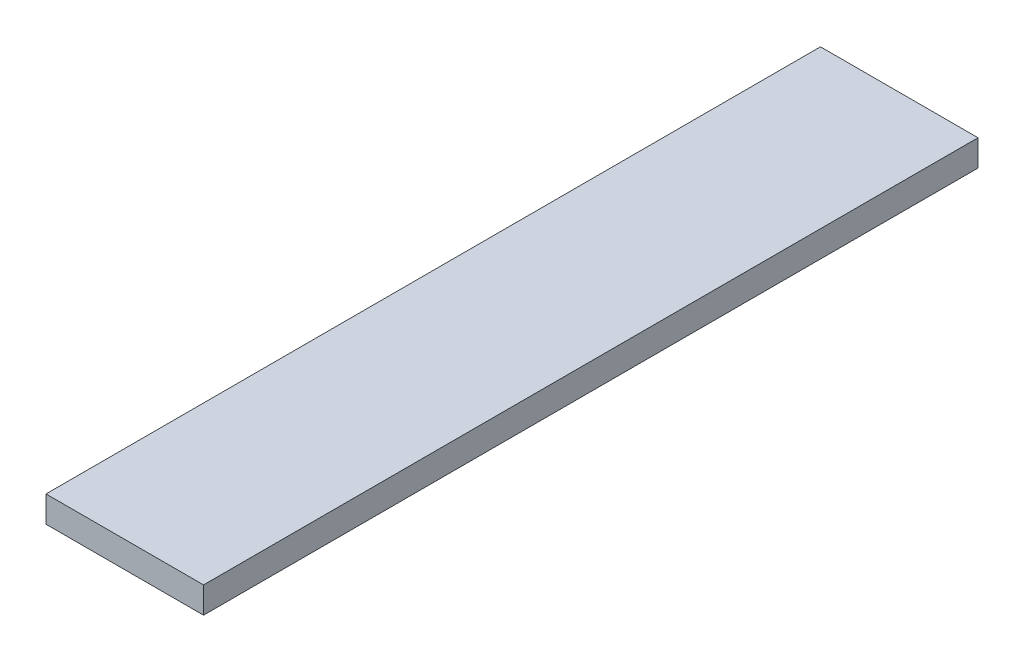
ISO-10303-21;
HEADER;
FILE_DESCRIPTION(('STEP AP214'),'2;1');
FILE_NAME('part.step','',(''),(''),'','','');
FILE_SCHEMA(('AUTOMOTIVE_DESIGN { 1 0 10303 214 1 1 1 1 }'));
ENDSEC;
DATA;
#1=APPLICATION_CONTEXT('core data for automotive mechanical design processes');
#2=APPLICATION_PROTOCOL_DEFINITION('international standard','automotive_design',2000,#1);
#3=PRODUCT_CONTEXT('',#1,'mechanical');
#4=PRODUCT('Part','Part','',(#3));
#5=PRODUCT_RELATED_PRODUCT_CATEGORY('part','',(#4));
#6=PRODUCT_DEFINITION_FORMATION('','',#4);
#7=PRODUCT_DEFINITION_CONTEXT('part definition',#1,'design');
#8=PRODUCT_DEFINITION('design','',#6,#7);
#9=PRODUCT_DEFINITION_SHAPE('','',#8);
#10=(LENGTH_UNIT() NAMED_UNIT(*) SI_UNIT(.MILLI.,.METRE.));
#11=(NAMED_UNIT(*) PLANE_ANGLE_UNIT() SI_UNIT($,.RADIAN.));
#12=(NAMED_UNIT(*) SI_UNIT($,.STERADIAN.) SOLID_ANGLE_UNIT());
#13=UNCERTAINTY_MEASURE_WITH_UNIT(LENGTH_MEASURE(1.E-05),#10,'distance_accuracy_value','');
#14=(GEOMETRIC_REPRESENTATION_CONTEXT(3) GLOBAL_UNCERTAINTY_ASSIGNED_CONTEXT((#13)) GLOBAL_UNIT_ASSIGNED_CONTEXT((#10,
#11,#12)) REPRESENTATION_CONTEXT('',''));
#15=CARTESIAN_POINT('',(0.,0.,0.));
#16=DIRECTION('',(0.,0.,1.));
#17=DIRECTION('',(1.,0.,0.));
#18=AXIS2_PLACEMENT_3D('',#15,#16,#17);
#19=CARTESIAN_POINT('',(9.52499999999999,-1.5875,93.65));
#20=DIRECTION('',(-1.,0.,0.));
#21=DIRECTION('',(0.,0.,1.));
#22=AXIS2_PLACEMENT_3D('',#19,#20,#21);
#23=PLANE('',#22);
#24=DIRECTION('',(0.,1.,0.));
#25=VECTOR('',#24,1.);
#26=CARTESIAN_POINT('',(9.52499999999999,-1.5875,0.));
#27=LINE('',#26,#25);
#28=CARTESIAN_POINT('',(9.52499999999999,-1.5875,0.));
#29=VERTEX_POINT('',#28);
#30=CARTESIAN_POINT('',(9.52499999999999,1.5875,0.));
#31=VERTEX_POINT('',#30);
#32=EDGE_CURVE('E96',#29,#31,#27,.T.);
#33=ORIENTED_EDGE('',*,*,#32,.T.);
#34=DIRECTION('',(0.,0.,-1.));
#35=VECTOR('',#34,1.);
#36=CARTESIAN_POINT('',(9.52499999999999,1.5875,93.65));
#37=LINE('',#36,#35);
#38=CARTESIAN_POINT('',(9.52499999999999,1.5875,93.65));
#39=VERTEX_POINT('',#38);
#40=EDGE_CURVE('E11',#39,#31,#37,.T.);
#41=ORIENTED_EDGE('',*,*,#40,.F.);
#42=DIRECTION('',(0.,1.,0.));
#43=VECTOR('',#42,1.);
#44=CARTESIAN_POINT('',(9.52499999999999,-1.5875,93.65));
#45=LINE('',#44,#43);
#46=CARTESIAN_POINT('',(9.52499999999999,-1.5875,93.65));
#47=VERTEX_POINT('',#46);
#48=EDGE_CURVE('E84',#47,#39,#45,.T.);
#49=ORIENTED_EDGE('',*,*,#48,.F.);
#50=DIRECTION('',(0.,0.,-1.));
#51=VECTOR('',#50,1.);
#52=CARTESIAN_POINT('',(9.52499999999999,-1.5875,93.65));
#53=LINE('',#52,#51);
#54=EDGE_CURVE('E92',#47,#29,#53,.T.);
#55=ORIENTED_EDGE('',*,*,#54,.T.);
#56=EDGE_LOOP('',(#33,#41,#49,#55));
#57=FACE_BOUND('',#56,.T.);
#58=ADVANCED_FACE('F33',(#57),#23,.F.);
#59=CARTESIAN_POINT('',(-9.52500000000001,1.5875,93.65));
#60=DIRECTION('',(0.,-1.,0.));
#61=DIRECTION('',(0.,0.,-1.));
#62=AXIS2_PLACEMENT_3D('',#59,#60,#61);
#63=PLANE('',#62);
#64=DIRECTION('',(-1.,0.,0.));
#65=VECTOR('',#64,1.);
#66=CARTESIAN_POINT('',(-9.52500000000001,1.5875,0.));
#67=LINE('',#66,#65);
#68=CARTESIAN_POINT('',(-9.52500000000001,1.5875,0.));
#69=VERTEX_POINT('',#68);
#70=EDGE_CURVE('E88',#31,#69,#67,.T.);
#71=ORIENTED_EDGE('',*,*,#70,.T.);
#72=DIRECTION('',(0.,0.,-1.));
#73=VECTOR('',#72,1.);
#74=CARTESIAN_POINT('',(-9.52500000000001,1.5875,93.65));
#75=LINE('',#74,#73);
#76=CARTESIAN_POINT('',(-9.52500000000001,1.5875,93.65));
#77=VERTEX_POINT('',#76);
#78=EDGE_CURVE('E41',#77,#69,#75,.T.);
#79=ORIENTED_EDGE('',*,*,#78,.F.);
#80=DIRECTION('',(-1.,0.,0.));
#81=VECTOR('',#80,1.);
#82=CARTESIAN_POINT('',(-9.52500000000001,1.5875,93.65));
#83=LINE('',#82,#81);
#84=EDGE_CURVE('E79',#39,#77,#83,.T.);
#85=ORIENTED_EDGE('',*,*,#84,.F.);
#86=ORIENTED_EDGE('',*,*,#40,.T.);
#87=EDGE_LOOP('',(#71,#79,#85,#86));
#88=FACE_BOUND('',#87,.T.);
#89=ADVANCED_FACE('F87',(#88),#63,.F.);
#90=CARTESIAN_POINT('',(-9.52500000000001,-1.5875,93.65));
#91=DIRECTION('',(1.,0.,0.));
#92=DIRECTION('',(0.,0.,-1.));
#93=AXIS2_PLACEMENT_3D('',#90,#91,#92);
#94=PLANE('',#93);
#95=DIRECTION('',(0.,-1.,0.));
#96=VECTOR('',#95,1.);
#97=CARTESIAN_POINT('',(-9.52500000000001,-1.5875,0.));
#98=LINE('',#97,#96);
#99=CARTESIAN_POINT('',(-9.52500000000001,-1.5875,0.));
#100=VERTEX_POINT('',#99);
#101=EDGE_CURVE('E66',#69,#100,#98,.T.);
#102=ORIENTED_EDGE('',*,*,#101,.T.);
#103=DIRECTION('',(0.,0.,-1.));
#104=VECTOR('',#103,1.);
#105=CARTESIAN_POINT('',(-9.52500000000001,-1.5875,93.65));
#106=LINE('',#105,#104);
#107=CARTESIAN_POINT('',(-9.52500000000001,-1.5875,93.65));
#108=VERTEX_POINT('',#107);
#109=EDGE_CURVE('E89',#108,#100,#106,.T.);
#110=ORIENTED_EDGE('',*,*,#109,.F.);
#111=DIRECTION('',(0.,-1.,0.));
#112=VECTOR('',#111,1.);
#113=CARTESIAN_POINT('',(-9.52500000000001,-1.5875,93.65));
#114=LINE('',#113,#112);
#115=EDGE_CURVE('E82',#77,#108,#114,.T.);
#116=ORIENTED_EDGE('',*,*,#115,.F.);
#117=ORIENTED_EDGE('',*,*,#78,.T.);
#118=EDGE_LOOP('',(#102,#110,#116,#117));
#119=FACE_BOUND('',#118,.T.);
#120=ADVANCED_FACE('F90',(#119),#94,.F.);
#121=CARTESIAN_POINT('',(-9.52500000000001,-1.5875,93.65));
#122=DIRECTION('',(0.,1.,0.));
#123=DIRECTION('',(0.,0.,1.));
#124=AXIS2_PLACEMENT_3D('',#121,#122,#123);
#125=PLANE('',#124);
#126=DIRECTION('',(1.,0.,0.));
#127=VECTOR('',#126,1.);
#128=CARTESIAN_POINT('',(-9.52500000000001,-1.5875,0.));
#129=LINE('',#128,#127);
#130=EDGE_CURVE('E72',#100,#29,#129,.T.);
#131=ORIENTED_EDGE('',*,*,#130,.T.);
#132=ORIENTED_EDGE('',*,*,#54,.F.);
#133=DIRECTION('',(1.,0.,0.));
#134=VECTOR('',#133,1.);
#135=CARTESIAN_POINT('',(-9.52500000000001,-1.5875,93.65));
#136=LINE('',#135,#134);
#137=EDGE_CURVE('E49',#108,#47,#136,.T.);
#138=ORIENTED_EDGE('',*,*,#137,.F.);
#139=ORIENTED_EDGE('',*,*,#109,.T.);
#140=EDGE_LOOP('',(#131,#132,#138,#139));
#141=FACE_BOUND('',#140,.T.);
#142=ADVANCED_FACE('F103',(#141),#125,.F.);
#143=CARTESIAN_POINT('',(0.,0.,93.65));
#144=DIRECTION('',(0.,0.,-1.));
#145=DIRECTION('',(-1.,0.,0.));
#146=AXIS2_PLACEMENT_3D('',#143,#144,#145);
#147=PLANE('',#146);
#148=ORIENTED_EDGE('',*,*,#48,.T.);
#149=ORIENTED_EDGE('',*,*,#84,.T.);
#150=ORIENTED_EDGE('',*,*,#115,.T.);
#151=ORIENTED_EDGE('',*,*,#137,.T.);
#152=EDGE_LOOP('',(#148,#149,#150,#151));
#153=FACE_BOUND('',#152,.T.);
#154=ADVANCED_FACE('F80',(#153),#147,.F.);
#155=CARTESIAN_POINT('',(0.,0.,0.));
#156=DIRECTION('',(0.,0.,-1.));
#157=DIRECTION('',(-1.,0.,0.));
#158=AXIS2_PLACEMENT_3D('',#155,#156,#157);
#159=PLANE('',#158);
#160=ORIENTED_EDGE('',*,*,#32,.F.);
#161=ORIENTED_EDGE('',*,*,#130,.F.);
#162=ORIENTED_EDGE('',*,*,#101,.F.);
#163=ORIENTED_EDGE('',*,*,#70,.F.);
#164=EDGE_LOOP('',(#160,#161,#162,#163));
#165=FACE_BOUND('',#164,.T.);
#166=ADVANCED_FACE('F106',(#165),#159,.T.);
#167=CLOSED_SHELL('',(#58,#89,#120,#142,#154,#166));
#168=MANIFOLD_SOLID_BREP('B2',#167);
#169=ADVANCED_BREP_SHAPE_REPRESENTATION('',(#18,#168),#14);
#170=SHAPE_DEFINITION_REPRESENTATION(#9,#169);
ENDSEC;
END-ISO-10303-21;
